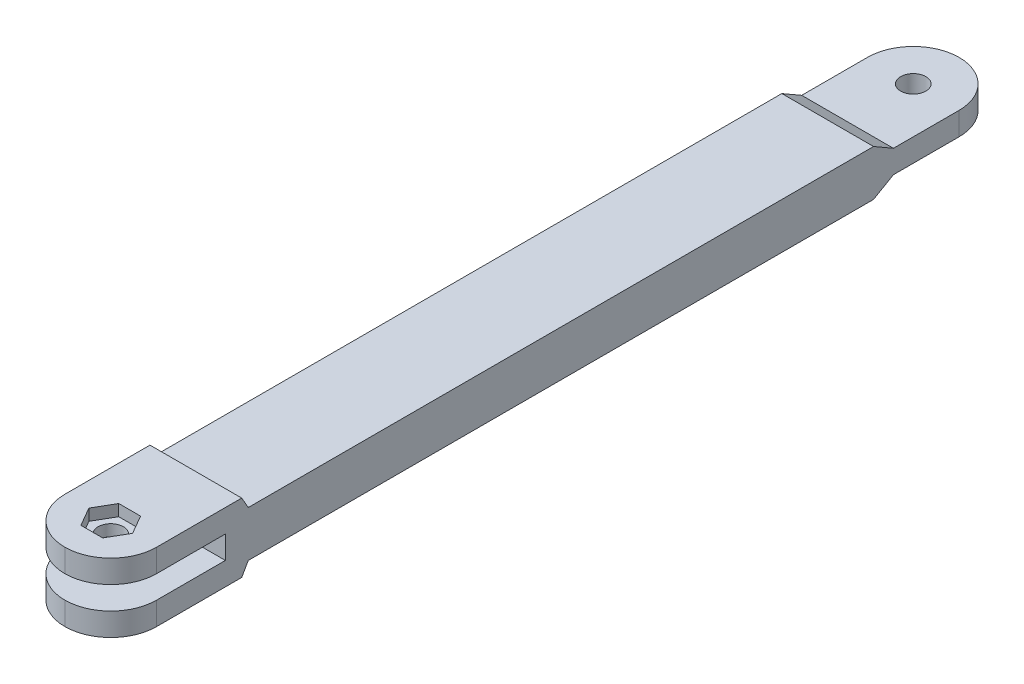
ISO-10303-21;
HEADER;
FILE_DESCRIPTION(('STEP AP214'),'2;1');
FILE_NAME('part.step','',(''),(''),'','','');
FILE_SCHEMA(('AUTOMOTIVE_DESIGN { 1 0 10303 214 1 1 1 1 }'));
ENDSEC;
DATA;
#1=APPLICATION_CONTEXT('core data for automotive mechanical design processes');
#2=APPLICATION_PROTOCOL_DEFINITION('international standard','automotive_design',2000,#1);
#3=PRODUCT_CONTEXT('',#1,'mechanical');
#4=PRODUCT('Part','Part','',(#3));
#5=PRODUCT_RELATED_PRODUCT_CATEGORY('part','',(#4));
#6=PRODUCT_DEFINITION_FORMATION('','',#4);
#7=PRODUCT_DEFINITION_CONTEXT('part definition',#1,'design');
#8=PRODUCT_DEFINITION('design','',#6,#7);
#9=PRODUCT_DEFINITION_SHAPE('','',#8);
#10=(LENGTH_UNIT() NAMED_UNIT(*) SI_UNIT(.MILLI.,.METRE.));
#11=(NAMED_UNIT(*) PLANE_ANGLE_UNIT() SI_UNIT($,.RADIAN.));
#12=(NAMED_UNIT(*) SI_UNIT($,.STERADIAN.) SOLID_ANGLE_UNIT());
#13=UNCERTAINTY_MEASURE_WITH_UNIT(LENGTH_MEASURE(1.E-05),#10,'distance_accuracy_value','');
#14=(GEOMETRIC_REPRESENTATION_CONTEXT(3) GLOBAL_UNCERTAINTY_ASSIGNED_CONTEXT((#13)) GLOBAL_UNIT_ASSIGNED_CONTEXT((#10,
#11,#12)) REPRESENTATION_CONTEXT('',''));
#15=CARTESIAN_POINT('',(0.,0.,0.));
#16=DIRECTION('',(0.,0.,1.));
#17=DIRECTION('',(1.,0.,0.));
#18=AXIS2_PLACEMENT_3D('',#15,#16,#17);
#19=CARTESIAN_POINT('',(-10.,7.5,100.));
#20=DIRECTION('',(0.,-1.,0.));
#21=DIRECTION('',(0.,0.,-1.));
#22=AXIS2_PLACEMENT_3D('',#19,#20,#21);
#23=PLANE('',#22);
#24=DIRECTION('',(0.,0.,-1.));
#25=VECTOR('',#24,1.);
#26=CARTESIAN_POINT('',(-10.,7.5,100.));
#27=LINE('',#26,#25);
#28=CARTESIAN_POINT('',(-10.,7.5,90.));
#29=VERTEX_POINT('',#28);
#30=CARTESIAN_POINT('',(-10.,7.5,71.443375672974));
#31=VERTEX_POINT('',#30);
#32=EDGE_CURVE('E299',#29,#31,#27,.T.);
#33=ORIENTED_EDGE('',*,*,#32,.F.);
#34=CARTESIAN_POINT('',(0.,7.5,90.));
#35=DIRECTION('',(0.,-1.,0.));
#36=DIRECTION('',(0.,0.,-1.));
#37=AXIS2_PLACEMENT_3D('',#34,#35,#36);
#38=CIRCLE('',#37,10.);
#39=CARTESIAN_POINT('',(0.,7.5,100.));
#40=VERTEX_POINT('',#39);
#41=EDGE_CURVE('E65',#29,#40,#38,.F.);
#42=ORIENTED_EDGE('',*,*,#41,.T.);
#43=CARTESIAN_POINT('',(0.,7.5,90.));
#44=DIRECTION('',(0.,-1.,0.));
#45=DIRECTION('',(0.,0.,-1.));
#46=AXIS2_PLACEMENT_3D('',#43,#44,#45);
#47=CIRCLE('',#46,10.);
#48=CARTESIAN_POINT('',(10.,7.5,90.));
#49=VERTEX_POINT('',#48);
#50=EDGE_CURVE('E456',#40,#49,#47,.F.);
#51=ORIENTED_EDGE('',*,*,#50,.T.);
#52=DIRECTION('',(0.,0.,-1.));
#53=VECTOR('',#52,1.);
#54=CARTESIAN_POINT('',(10.,7.5,100.));
#55=LINE('',#54,#53);
#56=CARTESIAN_POINT('',(10.,7.5,71.443375672974));
#57=VERTEX_POINT('',#56);
#58=EDGE_CURVE('E302',#49,#57,#55,.T.);
#59=ORIENTED_EDGE('',*,*,#58,.T.);
#60=DIRECTION('',(-1.,0.,0.));
#61=VECTOR('',#60,1.);
#62=CARTESIAN_POINT('',(-10.,7.5,71.443375672974));
#63=LINE('',#62,#61);
#64=EDGE_CURVE('E400',#57,#31,#63,.T.);
#65=ORIENTED_EDGE('',*,*,#64,.T.);
#66=EDGE_LOOP('',(#33,#42,#51,#59,#65));
#67=FACE_BOUND('',#66,.T.);
#68=DIRECTION('',(-1.,0.,0.));
#69=VECTOR('',#68,1.);
#70=CARTESIAN_POINT('',(-10.,7.5,85.875));
#71=LINE('',#70,#69);
#72=CARTESIAN_POINT('',(2.38156986040721,7.5,85.875));
#73=VERTEX_POINT('',#72);
#74=CARTESIAN_POINT('',(-2.38156986040721,7.5,85.875));
#75=VERTEX_POINT('',#74);
#76=EDGE_CURVE('E11',#73,#75,#71,.T.);
#77=ORIENTED_EDGE('',*,*,#76,.F.);
#78=DIRECTION('',(-0.5,0.,-0.866025403784439));
#79=VECTOR('',#78,1.);
#80=CARTESIAN_POINT('',(5.402481809533,7.5,91.1073729810778));
#81=LINE('',#80,#79);
#82=CARTESIAN_POINT('',(4.76313972081441,7.5,90.));
#83=VERTEX_POINT('',#82);
#84=EDGE_CURVE('E467',#83,#73,#81,.T.);
#85=ORIENTED_EDGE('',*,*,#84,.F.);
#86=DIRECTION('',(0.5,0.,-0.866025403784439));
#87=VECTOR('',#86,1.);
#88=CARTESIAN_POINT('',(-3.25777222831139,7.5,103.892627018922));
#89=LINE('',#88,#87);
#90=CARTESIAN_POINT('',(2.3815698604072,7.5,94.125));
#91=VERTEX_POINT('',#90);
#92=EDGE_CURVE('E485',#91,#83,#89,.T.);
#93=ORIENTED_EDGE('',*,*,#92,.F.);
#94=DIRECTION('',(1.,0.,0.));
#95=VECTOR('',#94,1.);
#96=CARTESIAN_POINT('',(-10.,7.5,94.125));
#97=LINE('',#96,#95);
#98=CARTESIAN_POINT('',(-2.3815698604072,7.5,94.125));
#99=VERTEX_POINT('',#98);
#100=EDGE_CURVE('E488',#99,#91,#97,.T.);
#101=ORIENTED_EDGE('',*,*,#100,.F.);
#102=DIRECTION('',(0.499999999999999,0.,0.866025403784439));
#103=VECTOR('',#102,1.);
#104=CARTESIAN_POINT('',(-1.74222777168861,7.5,95.2323729810778));
#105=LINE('',#104,#103);
#106=CARTESIAN_POINT('',(-4.76313972081441,7.5,90.));
#107=VERTEX_POINT('',#106);
#108=EDGE_CURVE('E491',#107,#99,#105,.T.);
#109=ORIENTED_EDGE('',*,*,#108,.F.);
#110=DIRECTION('',(-0.500000000000001,0.,0.866025403784438));
#111=VECTOR('',#110,1.);
#112=CARTESIAN_POINT('',(-10.402481809533,7.5,99.7676270189222));
#113=LINE('',#112,#111);
#114=EDGE_CURVE('E50',#75,#107,#113,.T.);
#115=ORIENTED_EDGE('',*,*,#114,.F.);
#116=EDGE_LOOP('',(#77,#85,#93,#101,#109,#115));
#117=FACE_BOUND('',#116,.T.);
#118=ADVANCED_FACE('F41',(#67,#117),#23,.F.);
#119=CARTESIAN_POINT('',(0.,-7.5,90.));
#120=DIRECTION('',(0.,1.,0.));
#121=DIRECTION('',(0.,0.,1.));
#122=AXIS2_PLACEMENT_3D('',#119,#120,#121);
#123=CYLINDRICAL_SURFACE('',#122,2.75);
#124=CARTESIAN_POINT('',(0.,2.5,90.));
#125=DIRECTION('',(0.,1.,0.));
#126=DIRECTION('',(-1.,0.,0.));
#127=AXIS2_PLACEMENT_3D('',#124,#125,#126);
#128=CIRCLE('',#127,2.75);
#129=CARTESIAN_POINT('',(-2.75,2.5,90.));
#130=VERTEX_POINT('',#129);
#131=EDGE_CURVE('E268',#130,#130,#128,.T.);
#132=ORIENTED_EDGE('',*,*,#131,.F.);
#133=EDGE_LOOP('',(#132));
#134=FACE_BOUND('',#133,.T.);
#135=CARTESIAN_POINT('',(0.,5.,90.));
#136=DIRECTION('',(0.,1.,0.));
#137=DIRECTION('',(0.,0.,1.));
#138=AXIS2_PLACEMENT_3D('',#135,#136,#137);
#139=CIRCLE('',#138,2.75);
#140=CARTESIAN_POINT('',(0.,5.,92.75));
#141=VERTEX_POINT('',#140);
#142=EDGE_CURVE('E219',#141,#141,#139,.F.);
#143=ORIENTED_EDGE('',*,*,#142,.F.);
#144=EDGE_LOOP('',(#143));
#145=FACE_BOUND('',#144,.T.);
#146=ADVANCED_FACE('F519',(#134,#145),#123,.F.);
#147=CARTESIAN_POINT('',(0.,0.,75.));
#148=DIRECTION('',(0.,0.,-1.));
#149=DIRECTION('',(-1.,0.,0.));
#150=AXIS2_PLACEMENT_3D('',#147,#148,#149);
#151=PLANE('',#150);
#152=DIRECTION('',(-1.,0.,0.));
#153=VECTOR('',#152,1.);
#154=CARTESIAN_POINT('',(-10.,-2.5,75.));
#155=LINE('',#154,#153);
#156=CARTESIAN_POINT('',(10.,-2.5,75.));
#157=VERTEX_POINT('',#156);
#158=CARTESIAN_POINT('',(-10.,-2.5,75.));
#159=VERTEX_POINT('',#158);
#160=EDGE_CURVE('E278',#157,#159,#155,.T.);
#161=ORIENTED_EDGE('',*,*,#160,.F.);
#162=DIRECTION('',(0.,1.,0.));
#163=VECTOR('',#162,1.);
#164=CARTESIAN_POINT('',(10.,-5.,75.));
#165=LINE('',#164,#163);
#166=CARTESIAN_POINT('',(10.,2.5,75.));
#167=VERTEX_POINT('',#166);
#168=EDGE_CURVE('E328',#157,#167,#165,.T.);
#169=ORIENTED_EDGE('',*,*,#168,.T.);
#170=DIRECTION('',(1.,0.,0.));
#171=VECTOR('',#170,1.);
#172=CARTESIAN_POINT('',(-10.,2.5,75.));
#173=LINE('',#172,#171);
#174=CARTESIAN_POINT('',(-10.,2.5,75.));
#175=VERTEX_POINT('',#174);
#176=EDGE_CURVE('E295',#175,#167,#173,.T.);
#177=ORIENTED_EDGE('',*,*,#176,.F.);
#178=DIRECTION('',(0.,-1.,0.));
#179=VECTOR('',#178,1.);
#180=CARTESIAN_POINT('',(-10.,-5.,75.));
#181=LINE('',#180,#179);
#182=EDGE_CURVE('E324',#175,#159,#181,.T.);
#183=ORIENTED_EDGE('',*,*,#182,.T.);
#184=EDGE_LOOP('',(#161,#169,#177,#183));
#185=FACE_BOUND('',#184,.T.);
#186=ADVANCED_FACE('F524',(#185),#151,.F.);
#187=CARTESIAN_POINT('',(-10.,-5.,-75.));
#188=DIRECTION('',(-1.,0.,0.));
#189=DIRECTION('',(0.,0.,1.));
#190=AXIS2_PLACEMENT_3D('',#187,#188,#189);
#191=PLANE('',#190);
#192=DIRECTION('',(0.,0.,-1.));
#193=VECTOR('',#192,1.);
#194=CARTESIAN_POINT('',(-10.,-7.5,100.));
#195=LINE('',#194,#193);
#196=CARTESIAN_POINT('',(-10.,-7.5,90.));
#197=VERTEX_POINT('',#196);
#198=CARTESIAN_POINT('',(-10.,-7.5,71.443375672974));
#199=VERTEX_POINT('',#198);
#200=EDGE_CURVE('E282',#197,#199,#195,.T.);
#201=ORIENTED_EDGE('',*,*,#200,.F.);
#202=DIRECTION('',(0.,-1.,0.));
#203=VECTOR('',#202,1.);
#204=CARTESIAN_POINT('',(-10.,-5.,90.));
#205=LINE('',#204,#203);
#206=CARTESIAN_POINT('',(-10.,-2.5,90.));
#207=VERTEX_POINT('',#206);
#208=EDGE_CURVE('E440',#197,#207,#205,.F.);
#209=ORIENTED_EDGE('',*,*,#208,.T.);
#210=DIRECTION('',(0.,0.,-1.));
#211=VECTOR('',#210,1.);
#212=CARTESIAN_POINT('',(-10.,-2.5,100.));
#213=LINE('',#212,#211);
#214=EDGE_CURVE('E286',#207,#159,#213,.T.);
#215=ORIENTED_EDGE('',*,*,#214,.T.);
#216=ORIENTED_EDGE('',*,*,#182,.F.);
#217=DIRECTION('',(0.,0.,-1.));
#218=VECTOR('',#217,1.);
#219=CARTESIAN_POINT('',(-10.,2.5,100.));
#220=LINE('',#219,#218);
#221=CARTESIAN_POINT('',(-10.,2.5,90.));
#222=VERTEX_POINT('',#221);
#223=EDGE_CURVE('E308',#222,#175,#220,.T.);
#224=ORIENTED_EDGE('',*,*,#223,.F.);
#225=DIRECTION('',(0.,-1.,0.));
#226=VECTOR('',#225,1.);
#227=CARTESIAN_POINT('',(-10.,-5.,90.));
#228=LINE('',#227,#226);
#229=EDGE_CURVE('E436',#222,#29,#228,.F.);
#230=ORIENTED_EDGE('',*,*,#229,.T.);
#231=ORIENTED_EDGE('',*,*,#32,.T.);
#232=DIRECTION('',(0.,-0.866025403784441,-0.499999999999996));
#233=VECTOR('',#232,1.);
#234=CARTESIAN_POINT('',(-10.,13.6602540378446,75.));
#235=LINE('',#234,#233);
#236=CARTESIAN_POINT('',(-10.,5.,69.9999999999999));
#237=VERTEX_POINT('',#236);
#238=EDGE_CURVE('E404',#31,#237,#235,.T.);
#239=ORIENTED_EDGE('',*,*,#238,.T.);
#240=DIRECTION('',(0.,0.,1.));
#241=VECTOR('',#240,1.);
#242=CARTESIAN_POINT('',(-10.,5.,-75.));
#243=LINE('',#242,#241);
#244=CARTESIAN_POINT('',(-10.,5.,-66.3397459621554));
#245=VERTEX_POINT('',#244);
#246=EDGE_CURVE('E333',#245,#237,#243,.T.);
#247=ORIENTED_EDGE('',*,*,#246,.F.);
#248=DIRECTION('',(0.,0.499999999999996,0.866025403784441));
#249=VECTOR('',#248,1.);
#250=CARTESIAN_POINT('',(-10.,-1.25000000000003,-77.1650635094611));
#251=LINE('',#250,#249);
#252=CARTESIAN_POINT('',(-10.,2.5,-70.6698729810777));
#253=VERTEX_POINT('',#252);
#254=EDGE_CURVE('E389',#245,#253,#251,.F.);
#255=ORIENTED_EDGE('',*,*,#254,.T.);
#256=DIRECTION('',(0.,0.,1.));
#257=VECTOR('',#256,1.);
#258=CARTESIAN_POINT('',(-10.,2.5,-95.));
#259=LINE('',#258,#257);
#260=CARTESIAN_POINT('',(-10.,2.5,-85.));
#261=VERTEX_POINT('',#260);
#262=EDGE_CURVE('E315',#261,#253,#259,.T.);
#263=ORIENTED_EDGE('',*,*,#262,.F.);
#264=DIRECTION('',(0.,1.,0.));
#265=VECTOR('',#264,1.);
#266=CARTESIAN_POINT('',(-10.,-5.,-85.));
#267=LINE('',#266,#265);
#268=CARTESIAN_POINT('',(-10.,-2.5,-85.));
#269=VERTEX_POINT('',#268);
#270=EDGE_CURVE('E354',#261,#269,#267,.F.);
#271=ORIENTED_EDGE('',*,*,#270,.T.);
#272=DIRECTION('',(0.,0.,1.));
#273=VECTOR('',#272,1.);
#274=CARTESIAN_POINT('',(-10.,-2.5,-95.));
#275=LINE('',#274,#273);
#276=CARTESIAN_POINT('',(-10.,-2.5,-70.6698729810777));
#277=VERTEX_POINT('',#276);
#278=EDGE_CURVE('E318',#269,#277,#275,.T.);
#279=ORIENTED_EDGE('',*,*,#278,.T.);
#280=DIRECTION('',(0.,0.499999999999996,-0.866025403784441));
#281=VECTOR('',#280,1.);
#282=CARTESIAN_POINT('',(-10.,-1.24999999999994,-72.8349364905389));
#283=LINE('',#282,#281);
#284=CARTESIAN_POINT('',(-10.,-5.,-66.3397459621554));
#285=VERTEX_POINT('',#284);
#286=EDGE_CURVE('E386',#277,#285,#283,.F.);
#287=ORIENTED_EDGE('',*,*,#286,.T.);
#288=DIRECTION('',(0.,0.,1.));
#289=VECTOR('',#288,1.);
#290=CARTESIAN_POINT('',(-10.,-5.,-75.));
#291=LINE('',#290,#289);
#292=CARTESIAN_POINT('',(-10.,-5.,69.9999999999999));
#293=VERTEX_POINT('',#292);
#294=EDGE_CURVE('E332',#285,#293,#291,.T.);
#295=ORIENTED_EDGE('',*,*,#294,.T.);
#296=DIRECTION('',(0.,-0.866025403784441,0.499999999999996));
#297=VECTOR('',#296,1.);
#298=CARTESIAN_POINT('',(-10.,-13.6602540378446,75.));
#299=LINE('',#298,#297);
#300=EDGE_CURVE('E418',#293,#199,#299,.T.);
#301=ORIENTED_EDGE('',*,*,#300,.T.);
#302=EDGE_LOOP('',(#201,#209,#215,#216,#224,#230,#231,#239,#247,#255,#263,#271,#279,#287,#295,#301));
#303=FACE_BOUND('',#302,.T.);
#304=ADVANCED_FACE('F549',(#303),#191,.T.);
#305=CARTESIAN_POINT('',(-10.,5.,-75.));
#306=DIRECTION('',(0.,1.,0.));
#307=DIRECTION('',(0.,0.,1.));
#308=AXIS2_PLACEMENT_3D('',#305,#306,#307);
#309=PLANE('',#308);
#310=ORIENTED_EDGE('',*,*,#246,.T.);
#311=DIRECTION('',(1.,0.,0.));
#312=VECTOR('',#311,1.);
#313=CARTESIAN_POINT('',(-10.,5.,69.9999999999999));
#314=LINE('',#313,#312);
#315=CARTESIAN_POINT('',(10.,5.,69.9999999999999));
#316=VERTEX_POINT('',#315);
#317=EDGE_CURVE('E374',#237,#316,#314,.T.);
#318=ORIENTED_EDGE('',*,*,#317,.T.);
#319=DIRECTION('',(0.,0.,1.));
#320=VECTOR('',#319,1.);
#321=CARTESIAN_POINT('',(10.,5.,-75.));
#322=LINE('',#321,#320);
#323=CARTESIAN_POINT('',(10.,5.,-66.3397459621554));
#324=VERTEX_POINT('',#323);
#325=EDGE_CURVE('E338',#324,#316,#322,.T.);
#326=ORIENTED_EDGE('',*,*,#325,.F.);
#327=DIRECTION('',(-1.,0.,0.));
#328=VECTOR('',#327,1.);
#329=CARTESIAN_POINT('',(-10.,5.,-66.3397459621554));
#330=LINE('',#329,#328);
#331=EDGE_CURVE('E367',#324,#245,#330,.T.);
#332=ORIENTED_EDGE('',*,*,#331,.T.);
#333=EDGE_LOOP('',(#310,#318,#326,#332));
#334=FACE_BOUND('',#333,.T.);
#335=ADVANCED_FACE('F551',(#334),#309,.T.);
#336=CARTESIAN_POINT('',(10.,-5.,-75.));
#337=DIRECTION('',(1.,0.,0.));
#338=DIRECTION('',(0.,0.,-1.));
#339=AXIS2_PLACEMENT_3D('',#336,#337,#338);
#340=PLANE('',#339);
#341=DIRECTION('',(0.,0.,-1.));
#342=VECTOR('',#341,1.);
#343=CARTESIAN_POINT('',(10.,-2.5,100.));
#344=LINE('',#343,#342);
#345=CARTESIAN_POINT('',(10.,-2.5,90.));
#346=VERTEX_POINT('',#345);
#347=EDGE_CURVE('E289',#346,#157,#344,.T.);
#348=ORIENTED_EDGE('',*,*,#347,.F.);
#349=DIRECTION('',(0.,1.,0.));
#350=VECTOR('',#349,1.);
#351=CARTESIAN_POINT('',(10.,-5.,90.));
#352=LINE('',#351,#350);
#353=CARTESIAN_POINT('',(10.,-7.5,90.));
#354=VERTEX_POINT('',#353);
#355=EDGE_CURVE('E464',#346,#354,#352,.F.);
#356=ORIENTED_EDGE('',*,*,#355,.T.);
#357=DIRECTION('',(0.,0.,-1.));
#358=VECTOR('',#357,1.);
#359=CARTESIAN_POINT('',(10.,-7.5,100.));
#360=LINE('',#359,#358);
#361=CARTESIAN_POINT('',(10.,-7.5,71.443375672974));
#362=VERTEX_POINT('',#361);
#363=EDGE_CURVE('E292',#354,#362,#360,.T.);
#364=ORIENTED_EDGE('',*,*,#363,.T.);
#365=DIRECTION('',(0.,0.866025403784441,-0.499999999999996));
#366=VECTOR('',#365,1.);
#367=CARTESIAN_POINT('',(10.,-13.6602540378446,75.));
#368=LINE('',#367,#366);
#369=CARTESIAN_POINT('',(10.,-5.,69.9999999999999));
#370=VERTEX_POINT('',#369);
#371=EDGE_CURVE('E415',#362,#370,#368,.T.);
#372=ORIENTED_EDGE('',*,*,#371,.T.);
#373=DIRECTION('',(0.,0.,1.));
#374=VECTOR('',#373,1.);
#375=CARTESIAN_POINT('',(10.,-5.,-75.));
#376=LINE('',#375,#374);
#377=CARTESIAN_POINT('',(10.,-5.,-66.3397459621554));
#378=VERTEX_POINT('',#377);
#379=EDGE_CURVE('E342',#378,#370,#376,.T.);
#380=ORIENTED_EDGE('',*,*,#379,.F.);
#381=DIRECTION('',(0.,-0.499999999999996,0.866025403784441));
#382=VECTOR('',#381,1.);
#383=CARTESIAN_POINT('',(10.,-1.24999999999994,-72.8349364905389));
#384=LINE('',#383,#382);
#385=CARTESIAN_POINT('',(10.,-2.5,-70.6698729810777));
#386=VERTEX_POINT('',#385);
#387=EDGE_CURVE('E393',#378,#386,#384,.F.);
#388=ORIENTED_EDGE('',*,*,#387,.T.);
#389=DIRECTION('',(0.,0.,1.));
#390=VECTOR('',#389,1.);
#391=CARTESIAN_POINT('',(10.,-2.5,-95.));
#392=LINE('',#391,#390);
#393=CARTESIAN_POINT('',(10.,-2.5,-85.));
#394=VERTEX_POINT('',#393);
#395=EDGE_CURVE('E321',#394,#386,#392,.T.);
#396=ORIENTED_EDGE('',*,*,#395,.F.);
#397=DIRECTION('',(0.,-1.,0.));
#398=VECTOR('',#397,1.);
#399=CARTESIAN_POINT('',(10.,-5.,-85.));
#400=LINE('',#399,#398);
#401=CARTESIAN_POINT('',(10.,2.5,-85.));
#402=VERTEX_POINT('',#401);
#403=EDGE_CURVE('E364',#394,#402,#400,.F.);
#404=ORIENTED_EDGE('',*,*,#403,.T.);
#405=DIRECTION('',(0.,0.,1.));
#406=VECTOR('',#405,1.);
#407=CARTESIAN_POINT('',(10.,2.5,-95.));
#408=LINE('',#407,#406);
#409=CARTESIAN_POINT('',(10.,2.5,-70.6698729810777));
#410=VERTEX_POINT('',#409);
#411=EDGE_CURVE('E312',#402,#410,#408,.T.);
#412=ORIENTED_EDGE('',*,*,#411,.T.);
#413=DIRECTION('',(0.,-0.499999999999996,-0.866025403784441));
#414=VECTOR('',#413,1.);
#415=CARTESIAN_POINT('',(10.,-1.25000000000003,-77.1650635094611));
#416=LINE('',#415,#414);
#417=EDGE_CURVE('E397',#410,#324,#416,.F.);
#418=ORIENTED_EDGE('',*,*,#417,.T.);
#419=ORIENTED_EDGE('',*,*,#325,.T.);
#420=DIRECTION('',(0.,0.866025403784441,0.499999999999996));
#421=VECTOR('',#420,1.);
#422=CARTESIAN_POINT('',(10.,13.6602540378446,75.));
#423=LINE('',#422,#421);
#424=EDGE_CURVE('E407',#316,#57,#423,.T.);
#425=ORIENTED_EDGE('',*,*,#424,.T.);
#426=ORIENTED_EDGE('',*,*,#58,.F.);
#427=DIRECTION('',(0.,1.,0.));
#428=VECTOR('',#427,1.);
#429=CARTESIAN_POINT('',(10.,-5.,90.));
#430=LINE('',#429,#428);
#431=CARTESIAN_POINT('',(10.,2.5,90.));
#432=VERTEX_POINT('',#431);
#433=EDGE_CURVE('E461',#49,#432,#430,.F.);
#434=ORIENTED_EDGE('',*,*,#433,.T.);
#435=DIRECTION('',(0.,0.,-1.));
#436=VECTOR('',#435,1.);
#437=CARTESIAN_POINT('',(10.,2.5,100.));
#438=LINE('',#437,#436);
#439=EDGE_CURVE('E305',#432,#167,#438,.T.);
#440=ORIENTED_EDGE('',*,*,#439,.T.);
#441=ORIENTED_EDGE('',*,*,#168,.F.);
#442=EDGE_LOOP('',(#348,#356,#364,#372,#380,#388,#396,#404,#412,#418,#419,#425,#426,#434,#440,#441));
#443=FACE_BOUND('',#442,.T.);
#444=ADVANCED_FACE('F554',(#443),#340,.T.);
#445=CARTESIAN_POINT('',(-10.,-5.,-75.));
#446=DIRECTION('',(0.,-1.,0.));
#447=DIRECTION('',(0.,0.,-1.));
#448=AXIS2_PLACEMENT_3D('',#445,#446,#447);
#449=PLANE('',#448);
#450=ORIENTED_EDGE('',*,*,#379,.T.);
#451=DIRECTION('',(-1.,0.,0.));
#452=VECTOR('',#451,1.);
#453=CARTESIAN_POINT('',(-10.,-5.,69.9999999999999));
#454=LINE('',#453,#452);
#455=EDGE_CURVE('E382',#370,#293,#454,.T.);
#456=ORIENTED_EDGE('',*,*,#455,.T.);
#457=ORIENTED_EDGE('',*,*,#294,.F.);
#458=DIRECTION('',(1.,0.,0.));
#459=VECTOR('',#458,1.);
#460=CARTESIAN_POINT('',(-10.,-5.,-66.3397459621554));
#461=LINE('',#460,#459);
#462=EDGE_CURVE('E378',#285,#378,#461,.T.);
#463=ORIENTED_EDGE('',*,*,#462,.T.);
#464=EDGE_LOOP('',(#450,#456,#457,#463));
#465=FACE_BOUND('',#464,.T.);
#466=ADVANCED_FACE('F545',(#465),#449,.T.);
#467=CARTESIAN_POINT('',(10.,-2.5,-95.));
#468=DIRECTION('',(0.,1.,0.));
#469=DIRECTION('',(0.,0.,1.));
#470=AXIS2_PLACEMENT_3D('',#467,#468,#469);
#471=PLANE('',#470);
#472=CARTESIAN_POINT('',(0.,-2.5,-85.));
#473=DIRECTION('',(0.,1.,0.));
#474=DIRECTION('',(0.,0.,1.));
#475=AXIS2_PLACEMENT_3D('',#472,#473,#474);
#476=CIRCLE('',#475,2.75);
#477=CARTESIAN_POINT('',(0.,-2.5,-82.25));
#478=VERTEX_POINT('',#477);
#479=EDGE_CURVE('E273',#478,#478,#476,.T.);
#480=ORIENTED_EDGE('',*,*,#479,.T.);
#481=EDGE_LOOP('',(#480));
#482=FACE_BOUND('',#481,.T.);
#483=ORIENTED_EDGE('',*,*,#278,.F.);
#484=CARTESIAN_POINT('',(0.,-2.5,-85.));
#485=DIRECTION('',(0.,1.,0.));
#486=DIRECTION('',(0.,0.,1.));
#487=AXIS2_PLACEMENT_3D('',#484,#485,#486);
#488=CIRCLE('',#487,10.);
#489=CARTESIAN_POINT('',(0.,-2.5,-95.));
#490=VERTEX_POINT('',#489);
#491=EDGE_CURVE('E361',#269,#490,#488,.F.);
#492=ORIENTED_EDGE('',*,*,#491,.T.);
#493=CARTESIAN_POINT('',(0.,-2.5,-85.));
#494=DIRECTION('',(0.,1.,0.));
#495=DIRECTION('',(0.,0.,1.));
#496=AXIS2_PLACEMENT_3D('',#493,#494,#495);
#497=CIRCLE('',#496,10.);
#498=EDGE_CURVE('E358',#490,#394,#497,.F.);
#499=ORIENTED_EDGE('',*,*,#498,.T.);
#500=ORIENTED_EDGE('',*,*,#395,.T.);
#501=DIRECTION('',(1.,0.,0.));
#502=VECTOR('',#501,1.);
#503=CARTESIAN_POINT('',(10.,-2.5,-70.6698729810777));
#504=LINE('',#503,#502);
#505=EDGE_CURVE('E426',#386,#277,#504,.F.);
#506=ORIENTED_EDGE('',*,*,#505,.T.);
#507=EDGE_LOOP('',(#483,#492,#499,#500,#506));
#508=FACE_BOUND('',#507,.T.);
#509=ADVANCED_FACE('F541',(#482,#508),#471,.F.);
#510=CARTESIAN_POINT('',(10.,2.5,-95.));
#511=DIRECTION('',(0.,-1.,0.));
#512=DIRECTION('',(0.,0.,-1.));
#513=AXIS2_PLACEMENT_3D('',#510,#511,#512);
#514=PLANE('',#513);
#515=CARTESIAN_POINT('',(0.,2.5,-85.));
#516=DIRECTION('',(0.,-1.,0.));
#517=DIRECTION('',(0.,0.,-1.));
#518=AXIS2_PLACEMENT_3D('',#515,#516,#517);
#519=CIRCLE('',#518,2.75);
#520=CARTESIAN_POINT('',(0.,2.5,-87.75));
#521=VERTEX_POINT('',#520);
#522=EDGE_CURVE('E272',#521,#521,#519,.T.);
#523=ORIENTED_EDGE('',*,*,#522,.T.);
#524=EDGE_LOOP('',(#523));
#525=FACE_BOUND('',#524,.T.);
#526=CARTESIAN_POINT('',(0.,2.5,-85.));
#527=DIRECTION('',(0.,-1.,0.));
#528=DIRECTION('',(0.,0.,-1.));
#529=AXIS2_PLACEMENT_3D('',#526,#527,#528);
#530=CIRCLE('',#529,10.);
#531=CARTESIAN_POINT('',(0.,2.5,-95.));
#532=VERTEX_POINT('',#531);
#533=EDGE_CURVE('E337',#402,#532,#530,.F.);
#534=ORIENTED_EDGE('',*,*,#533,.T.);
#535=CARTESIAN_POINT('',(0.,2.5,-85.));
#536=DIRECTION('',(0.,-1.,0.));
#537=DIRECTION('',(0.,0.,-1.));
#538=AXIS2_PLACEMENT_3D('',#535,#536,#537);
#539=CIRCLE('',#538,10.);
#540=EDGE_CURVE('E351',#532,#261,#539,.F.);
#541=ORIENTED_EDGE('',*,*,#540,.T.);
#542=ORIENTED_EDGE('',*,*,#262,.T.);
#543=DIRECTION('',(-1.,0.,0.));
#544=VECTOR('',#543,1.);
#545=CARTESIAN_POINT('',(10.,2.5,-70.6698729810777));
#546=LINE('',#545,#544);
#547=EDGE_CURVE('E422',#253,#410,#546,.F.);
#548=ORIENTED_EDGE('',*,*,#547,.T.);
#549=ORIENTED_EDGE('',*,*,#411,.F.);
#550=EDGE_LOOP('',(#534,#541,#542,#548,#549));
#551=FACE_BOUND('',#550,.T.);
#552=ADVANCED_FACE('F537',(#525,#551),#514,.F.);
#553=CARTESIAN_POINT('',(0.,0.,-85.));
#554=DIRECTION('',(0.,-1.,0.));
#555=DIRECTION('',(0.,0.,-1.));
#556=AXIS2_PLACEMENT_3D('',#553,#554,#555);
#557=CYLINDRICAL_SURFACE('',#556,10.);
#558=ORIENTED_EDGE('',*,*,#403,.F.);
#559=ORIENTED_EDGE('',*,*,#498,.F.);
#560=DIRECTION('',(0.,-1.,0.));
#561=VECTOR('',#560,1.);
#562=CARTESIAN_POINT('',(0.,0.,-95.));
#563=LINE('',#562,#561);
#564=EDGE_CURVE('E311',#532,#490,#563,.T.);
#565=ORIENTED_EDGE('',*,*,#564,.F.);
#566=ORIENTED_EDGE('',*,*,#533,.F.);
#567=EDGE_LOOP('',(#558,#559,#565,#566));
#568=FACE_BOUND('',#567,.T.);
#569=ADVANCED_FACE('F540',(#568),#557,.T.);
#570=CARTESIAN_POINT('',(0.,0.,-85.));
#571=DIRECTION('',(0.,1.,0.));
#572=DIRECTION('',(0.,0.,1.));
#573=AXIS2_PLACEMENT_3D('',#570,#571,#572);
#574=CYLINDRICAL_SURFACE('',#573,10.);
#575=ORIENTED_EDGE('',*,*,#491,.F.);
#576=ORIENTED_EDGE('',*,*,#270,.F.);
#577=ORIENTED_EDGE('',*,*,#540,.F.);
#578=ORIENTED_EDGE('',*,*,#564,.T.);
#579=EDGE_LOOP('',(#575,#576,#577,#578));
#580=FACE_BOUND('',#579,.T.);
#581=ADVANCED_FACE('F535',(#580),#574,.T.);
#582=CARTESIAN_POINT('',(-10.,2.5,100.));
#583=DIRECTION('',(0.,1.,0.));
#584=DIRECTION('',(-1.,0.,0.));
#585=AXIS2_PLACEMENT_3D('',#582,#583,#584);
#586=PLANE('',#585);
#587=ORIENTED_EDGE('',*,*,#131,.T.);
#588=EDGE_LOOP('',(#587));
#589=FACE_BOUND('',#588,.T.);
#590=CARTESIAN_POINT('',(0.,2.5,90.));
#591=DIRECTION('',(0.,1.,0.));
#592=DIRECTION('',(-1.,0.,0.));
#593=AXIS2_PLACEMENT_3D('',#590,#591,#592);
#594=CIRCLE('',#593,10.);
#595=CARTESIAN_POINT('',(0.,2.5,100.));
#596=VERTEX_POINT('',#595);
#597=EDGE_CURVE('E450',#432,#596,#594,.F.);
#598=ORIENTED_EDGE('',*,*,#597,.T.);
#599=CARTESIAN_POINT('',(0.,2.5,90.));
#600=DIRECTION('',(0.,1.,0.));
#601=DIRECTION('',(-1.,0.,0.));
#602=AXIS2_PLACEMENT_3D('',#599,#600,#601);
#603=CIRCLE('',#602,10.);
#604=EDGE_CURVE('E453',#596,#222,#603,.F.);
#605=ORIENTED_EDGE('',*,*,#604,.T.);
#606=ORIENTED_EDGE('',*,*,#223,.T.);
#607=ORIENTED_EDGE('',*,*,#176,.T.);
#608=ORIENTED_EDGE('',*,*,#439,.F.);
#609=EDGE_LOOP('',(#598,#605,#606,#607,#608));
#610=FACE_BOUND('',#609,.T.);
#611=ADVANCED_FACE('F532',(#589,#610),#586,.F.);
#612=CARTESIAN_POINT('',(-10.,-7.5,100.));
#613=DIRECTION('',(0.,1.,0.));
#614=DIRECTION('',(0.,0.,1.));
#615=AXIS2_PLACEMENT_3D('',#612,#613,#614);
#616=PLANE('',#615);
#617=CARTESIAN_POINT('',(0.,-7.5,90.));
#618=DIRECTION('',(0.,1.,0.));
#619=DIRECTION('',(0.,0.,1.));
#620=AXIS2_PLACEMENT_3D('',#617,#618,#619);
#621=CIRCLE('',#620,2.75);
#622=CARTESIAN_POINT('',(0.,-7.5,92.75));
#623=VERTEX_POINT('',#622);
#624=EDGE_CURVE('E263',#623,#623,#621,.T.);
#625=ORIENTED_EDGE('',*,*,#624,.T.);
#626=EDGE_LOOP('',(#625));
#627=FACE_BOUND('',#626,.T.);
#628=CARTESIAN_POINT('',(0.,-7.5,90.));
#629=DIRECTION('',(0.,1.,0.));
#630=DIRECTION('',(0.,0.,1.));
#631=AXIS2_PLACEMENT_3D('',#628,#629,#630);
#632=CIRCLE('',#631,10.);
#633=CARTESIAN_POINT('',(0.,-7.5,100.));
#634=VERTEX_POINT('',#633);
#635=EDGE_CURVE('E430',#354,#634,#632,.F.);
#636=ORIENTED_EDGE('',*,*,#635,.T.);
#637=CARTESIAN_POINT('',(0.,-7.5,90.));
#638=DIRECTION('',(0.,1.,0.));
#639=DIRECTION('',(0.,0.,1.));
#640=AXIS2_PLACEMENT_3D('',#637,#638,#639);
#641=CIRCLE('',#640,10.);
#642=EDGE_CURVE('E433',#634,#197,#641,.F.);
#643=ORIENTED_EDGE('',*,*,#642,.T.);
#644=ORIENTED_EDGE('',*,*,#200,.T.);
#645=DIRECTION('',(1.,0.,0.));
#646=VECTOR('',#645,1.);
#647=CARTESIAN_POINT('',(-10.,-7.5,71.443375672974));
#648=LINE('',#647,#646);
#649=EDGE_CURVE('E411',#199,#362,#648,.T.);
#650=ORIENTED_EDGE('',*,*,#649,.T.);
#651=ORIENTED_EDGE('',*,*,#363,.F.);
#652=EDGE_LOOP('',(#636,#643,#644,#650,#651));
#653=FACE_BOUND('',#652,.T.);
#654=ADVANCED_FACE('F530',(#627,#653),#616,.F.);
#655=CARTESIAN_POINT('',(-10.,-2.5,100.));
#656=DIRECTION('',(0.,-1.,0.));
#657=DIRECTION('',(1.,0.,0.));
#658=AXIS2_PLACEMENT_3D('',#655,#656,#657);
#659=PLANE('',#658);
#660=CARTESIAN_POINT('',(0.,-2.5,90.));
#661=DIRECTION('',(0.,-1.,0.));
#662=DIRECTION('',(1.,0.,0.));
#663=AXIS2_PLACEMENT_3D('',#660,#661,#662);
#664=CIRCLE('',#663,2.75);
#665=CARTESIAN_POINT('',(2.75,-2.5,90.));
#666=VERTEX_POINT('',#665);
#667=EDGE_CURVE('E267',#666,#666,#664,.T.);
#668=ORIENTED_EDGE('',*,*,#667,.T.);
#669=EDGE_LOOP('',(#668));
#670=FACE_BOUND('',#669,.T.);
#671=ORIENTED_EDGE('',*,*,#214,.F.);
#672=CARTESIAN_POINT('',(0.,-2.5,90.));
#673=DIRECTION('',(0.,-1.,0.));
#674=DIRECTION('',(1.,0.,0.));
#675=AXIS2_PLACEMENT_3D('',#672,#673,#674);
#676=CIRCLE('',#675,10.);
#677=CARTESIAN_POINT('',(0.,-2.5,100.));
#678=VERTEX_POINT('',#677);
#679=EDGE_CURVE('E447',#207,#678,#676,.F.);
#680=ORIENTED_EDGE('',*,*,#679,.T.);
#681=CARTESIAN_POINT('',(0.,-2.5,90.));
#682=DIRECTION('',(0.,-1.,0.));
#683=DIRECTION('',(1.,0.,0.));
#684=AXIS2_PLACEMENT_3D('',#681,#682,#683);
#685=CIRCLE('',#684,10.);
#686=EDGE_CURVE('E444',#678,#346,#685,.F.);
#687=ORIENTED_EDGE('',*,*,#686,.T.);
#688=ORIENTED_EDGE('',*,*,#347,.T.);
#689=ORIENTED_EDGE('',*,*,#160,.T.);
#690=EDGE_LOOP('',(#671,#680,#687,#688,#689));
#691=FACE_BOUND('',#690,.T.);
#692=ADVANCED_FACE('F575',(#670,#691),#659,.F.);
#693=CARTESIAN_POINT('',(0.,13.6602540378446,75.));
#694=DIRECTION('',(0.,-0.499999999999996,0.866025403784441));
#695=DIRECTION('',(-1.,0.,0.));
#696=AXIS2_PLACEMENT_3D('',#693,#694,#695);
#697=PLANE('',#696);
#698=ORIENTED_EDGE('',*,*,#424,.F.);
#699=ORIENTED_EDGE('',*,*,#317,.F.);
#700=ORIENTED_EDGE('',*,*,#238,.F.);
#701=ORIENTED_EDGE('',*,*,#64,.F.);
#702=EDGE_LOOP('',(#698,#699,#700,#701));
#703=FACE_BOUND('',#702,.T.);
#704=ADVANCED_FACE('F571',(#703),#697,.F.);
#705=CARTESIAN_POINT('',(0.,-13.6602540378446,75.));
#706=DIRECTION('',(0.,0.499999999999996,0.866025403784441));
#707=DIRECTION('',(1.,0.,0.));
#708=AXIS2_PLACEMENT_3D('',#705,#706,#707);
#709=PLANE('',#708);
#710=ORIENTED_EDGE('',*,*,#300,.F.);
#711=ORIENTED_EDGE('',*,*,#455,.F.);
#712=ORIENTED_EDGE('',*,*,#371,.F.);
#713=ORIENTED_EDGE('',*,*,#649,.F.);
#714=EDGE_LOOP('',(#710,#711,#712,#713));
#715=FACE_BOUND('',#714,.T.);
#716=ADVANCED_FACE('F574',(#715),#709,.F.);
#717=CARTESIAN_POINT('',(-10.,5.,-66.3397459621554));
#718=DIRECTION('',(0.,-0.866025403784441,0.499999999999996));
#719=DIRECTION('',(-1.,0.,0.));
#720=AXIS2_PLACEMENT_3D('',#717,#718,#719);
#721=PLANE('',#720);
#722=ORIENTED_EDGE('',*,*,#417,.F.);
#723=ORIENTED_EDGE('',*,*,#547,.F.);
#724=ORIENTED_EDGE('',*,*,#254,.F.);
#725=ORIENTED_EDGE('',*,*,#331,.F.);
#726=EDGE_LOOP('',(#722,#723,#724,#725));
#727=FACE_BOUND('',#726,.T.);
#728=ADVANCED_FACE('F579',(#727),#721,.F.);
#729=CARTESIAN_POINT('',(-10.,-5.,-66.3397459621554));
#730=DIRECTION('',(0.,0.866025403784441,0.499999999999996));
#731=DIRECTION('',(1.,0.,0.));
#732=AXIS2_PLACEMENT_3D('',#729,#730,#731);
#733=PLANE('',#732);
#734=ORIENTED_EDGE('',*,*,#286,.F.);
#735=ORIENTED_EDGE('',*,*,#505,.F.);
#736=ORIENTED_EDGE('',*,*,#387,.F.);
#737=ORIENTED_EDGE('',*,*,#462,.F.);
#738=EDGE_LOOP('',(#734,#735,#736,#737));
#739=FACE_BOUND('',#738,.T.);
#740=ADVANCED_FACE('F583',(#739),#733,.F.);
#741=CARTESIAN_POINT('',(0.,0.,90.));
#742=DIRECTION('',(0.,1.,0.));
#743=DIRECTION('',(0.,0.,1.));
#744=AXIS2_PLACEMENT_3D('',#741,#742,#743);
#745=CYLINDRICAL_SURFACE('',#744,10.);
#746=ORIENTED_EDGE('',*,*,#355,.F.);
#747=ORIENTED_EDGE('',*,*,#686,.F.);
#748=DIRECTION('',(0.,1.,0.));
#749=VECTOR('',#748,1.);
#750=CARTESIAN_POINT('',(0.,0.,100.));
#751=LINE('',#750,#749);
#752=EDGE_CURVE('E283',#634,#678,#751,.T.);
#753=ORIENTED_EDGE('',*,*,#752,.F.);
#754=ORIENTED_EDGE('',*,*,#635,.F.);
#755=EDGE_LOOP('',(#746,#747,#753,#754));
#756=FACE_BOUND('',#755,.T.);
#757=ADVANCED_FACE('F587',(#756),#745,.T.);
#758=CARTESIAN_POINT('',(0.,0.,90.));
#759=DIRECTION('',(0.,-1.,0.));
#760=DIRECTION('',(0.,0.,-1.));
#761=AXIS2_PLACEMENT_3D('',#758,#759,#760);
#762=CYLINDRICAL_SURFACE('',#761,10.);
#763=ORIENTED_EDGE('',*,*,#679,.F.);
#764=ORIENTED_EDGE('',*,*,#208,.F.);
#765=ORIENTED_EDGE('',*,*,#642,.F.);
#766=ORIENTED_EDGE('',*,*,#752,.T.);
#767=EDGE_LOOP('',(#763,#764,#765,#766));
#768=FACE_BOUND('',#767,.T.);
#769=ADVANCED_FACE('F589',(#768),#762,.T.);
#770=CARTESIAN_POINT('',(0.,0.,90.));
#771=DIRECTION('',(0.,1.,0.));
#772=DIRECTION('',(0.,0.,1.));
#773=AXIS2_PLACEMENT_3D('',#770,#771,#772);
#774=CYLINDRICAL_SURFACE('',#773,10.);
#775=ORIENTED_EDGE('',*,*,#433,.F.);
#776=ORIENTED_EDGE('',*,*,#50,.F.);
#777=DIRECTION('',(0.,1.,0.));
#778=VECTOR('',#777,1.);
#779=CARTESIAN_POINT('',(0.,0.,100.));
#780=LINE('',#779,#778);
#781=EDGE_CURVE('E277',#596,#40,#780,.T.);
#782=ORIENTED_EDGE('',*,*,#781,.F.);
#783=ORIENTED_EDGE('',*,*,#597,.F.);
#784=EDGE_LOOP('',(#775,#776,#782,#783));
#785=FACE_BOUND('',#784,.T.);
#786=ADVANCED_FACE('F43',(#785),#774,.T.);
#787=CARTESIAN_POINT('',(0.,0.,90.));
#788=DIRECTION('',(0.,-1.,0.));
#789=DIRECTION('',(0.,0.,-1.));
#790=AXIS2_PLACEMENT_3D('',#787,#788,#789);
#791=CYLINDRICAL_SURFACE('',#790,10.);
#792=ORIENTED_EDGE('',*,*,#41,.F.);
#793=ORIENTED_EDGE('',*,*,#229,.F.);
#794=ORIENTED_EDGE('',*,*,#604,.F.);
#795=ORIENTED_EDGE('',*,*,#781,.T.);
#796=EDGE_LOOP('',(#792,#793,#794,#795));
#797=FACE_BOUND('',#796,.T.);
#798=ADVANCED_FACE('F595',(#797),#791,.T.);
#799=ORIENTED_EDGE('',*,*,#624,.F.);
#800=EDGE_LOOP('',(#799));
#801=FACE_BOUND('',#800,.T.);
#802=ORIENTED_EDGE('',*,*,#667,.F.);
#803=EDGE_LOOP('',(#802));
#804=FACE_BOUND('',#803,.T.);
#805=ADVANCED_FACE('F527',(#801,#804),#123,.F.);
#806=CARTESIAN_POINT('',(0.,-7.5,-85.));
#807=DIRECTION('',(0.,1.,0.));
#808=DIRECTION('',(0.,0.,1.));
#809=AXIS2_PLACEMENT_3D('',#806,#807,#808);
#810=CYLINDRICAL_SURFACE('',#809,2.75);
#811=ORIENTED_EDGE('',*,*,#522,.F.);
#812=EDGE_LOOP('',(#811));
#813=FACE_BOUND('',#812,.T.);
#814=ORIENTED_EDGE('',*,*,#479,.F.);
#815=EDGE_LOOP('',(#814));
#816=FACE_BOUND('',#815,.T.);
#817=ADVANCED_FACE('F602',(#813,#816),#810,.F.);
#818=CARTESIAN_POINT('',(2.38156986040721,7.500012,85.875));
#819=DIRECTION('',(0.,0.,1.));
#820=DIRECTION('',(1.,0.,0.));
#821=AXIS2_PLACEMENT_3D('',#818,#819,#820);
#822=PLANE('',#821);
#823=ORIENTED_EDGE('',*,*,#76,.T.);
#824=DIRECTION('',(0.,-1.,0.));
#825=VECTOR('',#824,1.);
#826=CARTESIAN_POINT('',(-2.38156986040721,7.500012,85.875));
#827=LINE('',#826,#825);
#828=CARTESIAN_POINT('',(-2.38156986040721,5.,85.875));
#829=VERTEX_POINT('',#828);
#830=EDGE_CURVE('E208',#75,#829,#827,.T.);
#831=ORIENTED_EDGE('',*,*,#830,.T.);
#832=DIRECTION('',(-1.,0.,0.));
#833=VECTOR('',#832,1.);
#834=CARTESIAN_POINT('',(2.38156986040721,5.,85.875));
#835=LINE('',#834,#833);
#836=CARTESIAN_POINT('',(2.38156986040721,5.,85.875));
#837=VERTEX_POINT('',#836);
#838=EDGE_CURVE('E213',#837,#829,#835,.T.);
#839=ORIENTED_EDGE('',*,*,#838,.F.);
#840=DIRECTION('',(0.,-1.,0.));
#841=VECTOR('',#840,1.);
#842=CARTESIAN_POINT('',(2.38156986040721,7.500012,85.875));
#843=LINE('',#842,#841);
#844=EDGE_CURVE('E250',#73,#837,#843,.T.);
#845=ORIENTED_EDGE('',*,*,#844,.F.);
#846=EDGE_LOOP('',(#823,#831,#839,#845));
#847=FACE_BOUND('',#846,.T.);
#848=ADVANCED_FACE('F210',(#847),#822,.T.);
#849=CARTESIAN_POINT('',(-2.38156986040721,7.500012,85.875));
#850=DIRECTION('',(0.866025403784438,0.,0.500000000000001));
#851=DIRECTION('',(0.500000000000001,0.,-0.866025403784438));
#852=AXIS2_PLACEMENT_3D('',#849,#850,#851);
#853=PLANE('',#852);
#854=ORIENTED_EDGE('',*,*,#114,.T.);
#855=DIRECTION('',(0.,-1.,0.));
#856=VECTOR('',#855,1.);
#857=CARTESIAN_POINT('',(-4.76313972081441,7.500012,90.));
#858=LINE('',#857,#856);
#859=CARTESIAN_POINT('',(-4.76313972081441,5.,90.));
#860=VERTEX_POINT('',#859);
#861=EDGE_CURVE('E220',#107,#860,#858,.T.);
#862=ORIENTED_EDGE('',*,*,#861,.T.);
#863=DIRECTION('',(-0.500000000000001,0.,0.866025403784438));
#864=VECTOR('',#863,1.);
#865=CARTESIAN_POINT('',(-2.38156986040721,5.,85.875));
#866=LINE('',#865,#864);
#867=EDGE_CURVE('E223',#829,#860,#866,.T.);
#868=ORIENTED_EDGE('',*,*,#867,.F.);
#869=ORIENTED_EDGE('',*,*,#830,.F.);
#870=EDGE_LOOP('',(#854,#862,#868,#869));
#871=FACE_BOUND('',#870,.T.);
#872=ADVANCED_FACE('F224',(#871),#853,.T.);
#873=CARTESIAN_POINT('',(-4.76313972081441,7.500012,90.));
#874=DIRECTION('',(0.866025403784439,0.,-0.499999999999999));
#875=DIRECTION('',(-0.499999999999999,0.,-0.866025403784439));
#876=AXIS2_PLACEMENT_3D('',#873,#874,#875);
#877=PLANE('',#876);
#878=ORIENTED_EDGE('',*,*,#108,.T.);
#879=DIRECTION('',(0.,-1.,0.));
#880=VECTOR('',#879,1.);
#881=CARTESIAN_POINT('',(-2.3815698604072,7.500012,94.125));
#882=LINE('',#881,#880);
#883=CARTESIAN_POINT('',(-2.3815698604072,5.,94.125));
#884=VERTEX_POINT('',#883);
#885=EDGE_CURVE('E258',#99,#884,#882,.T.);
#886=ORIENTED_EDGE('',*,*,#885,.T.);
#887=DIRECTION('',(0.499999999999999,0.,0.866025403784439));
#888=VECTOR('',#887,1.);
#889=CARTESIAN_POINT('',(-4.76313972081441,5.,90.));
#890=LINE('',#889,#888);
#891=EDGE_CURVE('E230',#860,#884,#890,.T.);
#892=ORIENTED_EDGE('',*,*,#891,.F.);
#893=ORIENTED_EDGE('',*,*,#861,.F.);
#894=EDGE_LOOP('',(#878,#886,#892,#893));
#895=FACE_BOUND('',#894,.T.);
#896=ADVANCED_FACE('F497',(#895),#877,.T.);
#897=CARTESIAN_POINT('',(-2.3815698604072,7.500012,94.125));
#898=DIRECTION('',(0.,0.,-1.));
#899=DIRECTION('',(-1.,0.,0.));
#900=AXIS2_PLACEMENT_3D('',#897,#898,#899);
#901=PLANE('',#900);
#902=ORIENTED_EDGE('',*,*,#100,.T.);
#903=DIRECTION('',(0.,-1.,0.));
#904=VECTOR('',#903,1.);
#905=CARTESIAN_POINT('',(2.3815698604072,7.500012,94.125));
#906=LINE('',#905,#904);
#907=CARTESIAN_POINT('',(2.3815698604072,5.,94.125));
#908=VERTEX_POINT('',#907);
#909=EDGE_CURVE('E255',#91,#908,#906,.T.);
#910=ORIENTED_EDGE('',*,*,#909,.T.);
#911=DIRECTION('',(1.,0.,0.));
#912=VECTOR('',#911,1.);
#913=CARTESIAN_POINT('',(-2.3815698604072,5.,94.125));
#914=LINE('',#913,#912);
#915=EDGE_CURVE('E241',#884,#908,#914,.T.);
#916=ORIENTED_EDGE('',*,*,#915,.F.);
#917=ORIENTED_EDGE('',*,*,#885,.F.);
#918=EDGE_LOOP('',(#902,#910,#916,#917));
#919=FACE_BOUND('',#918,.T.);
#920=ADVANCED_FACE('F504',(#919),#901,.T.);
#921=CARTESIAN_POINT('',(2.3815698604072,7.500012,94.125));
#922=DIRECTION('',(-0.866025403784439,0.,-0.5));
#923=DIRECTION('',(-0.5,0.,0.866025403784439));
#924=AXIS2_PLACEMENT_3D('',#921,#922,#923);
#925=PLANE('',#924);
#926=ORIENTED_EDGE('',*,*,#92,.T.);
#927=DIRECTION('',(0.,-1.,0.));
#928=VECTOR('',#927,1.);
#929=CARTESIAN_POINT('',(4.76313972081441,7.500012,90.));
#930=LINE('',#929,#928);
#931=CARTESIAN_POINT('',(4.76313972081441,5.,90.));
#932=VERTEX_POINT('',#931);
#933=EDGE_CURVE('E57',#83,#932,#930,.T.);
#934=ORIENTED_EDGE('',*,*,#933,.T.);
#935=DIRECTION('',(0.5,0.,-0.866025403784438));
#936=VECTOR('',#935,1.);
#937=CARTESIAN_POINT('',(2.3815698604072,5.,94.125));
#938=LINE('',#937,#936);
#939=EDGE_CURVE('E245',#908,#932,#938,.T.);
#940=ORIENTED_EDGE('',*,*,#939,.F.);
#941=ORIENTED_EDGE('',*,*,#909,.F.);
#942=EDGE_LOOP('',(#926,#934,#940,#941));
#943=FACE_BOUND('',#942,.T.);
#944=ADVANCED_FACE('F508',(#943),#925,.T.);
#945=CARTESIAN_POINT('',(4.76313972081441,7.500012,90.));
#946=DIRECTION('',(-0.866025403784439,0.,0.5));
#947=DIRECTION('',(0.5,0.,0.866025403784439));
#948=AXIS2_PLACEMENT_3D('',#945,#946,#947);
#949=PLANE('',#948);
#950=ORIENTED_EDGE('',*,*,#84,.T.);
#951=ORIENTED_EDGE('',*,*,#844,.T.);
#952=DIRECTION('',(-0.5,0.,-0.866025403784439));
#953=VECTOR('',#952,1.);
#954=CARTESIAN_POINT('',(4.76313972081441,5.,90.));
#955=LINE('',#954,#953);
#956=EDGE_CURVE('E235',#932,#837,#955,.T.);
#957=ORIENTED_EDGE('',*,*,#956,.F.);
#958=ORIENTED_EDGE('',*,*,#933,.F.);
#959=EDGE_LOOP('',(#950,#951,#957,#958));
#960=FACE_BOUND('',#959,.T.);
#961=ADVANCED_FACE('F509',(#960),#949,.T.);
#962=CARTESIAN_POINT('',(0.,5.,0.));
#963=DIRECTION('',(0.,1.,0.));
#964=DIRECTION('',(0.,0.,1.));
#965=AXIS2_PLACEMENT_3D('',#962,#963,#964);
#966=PLANE('',#965);
#967=ORIENTED_EDGE('',*,*,#838,.T.);
#968=ORIENTED_EDGE('',*,*,#867,.T.);
#969=ORIENTED_EDGE('',*,*,#891,.T.);
#970=ORIENTED_EDGE('',*,*,#915,.T.);
#971=ORIENTED_EDGE('',*,*,#939,.T.);
#972=ORIENTED_EDGE('',*,*,#956,.T.);
#973=EDGE_LOOP('',(#967,#968,#969,#970,#971,#972));
#974=FACE_BOUND('',#973,.T.);
#975=ORIENTED_EDGE('',*,*,#142,.T.);
#976=EDGE_LOOP('',(#975));
#977=FACE_BOUND('',#976,.T.);
#978=ADVANCED_FACE('F232',(#974,#977),#966,.T.);
#979=CLOSED_SHELL('',(#118,#146,#186,#304,#335,#444,#466,#509,#552,#569,#581,#611,#654,#692,
#704,#716,#728,#740,#757,#769,#786,#798,#805,#817,#848,#872,#896,#920,#944,#961,#978));
#980=MANIFOLD_SOLID_BREP('B2',#979);
#981=ADVANCED_BREP_SHAPE_REPRESENTATION('',(#18,#980),#14);
#982=SHAPE_DEFINITION_REPRESENTATION(#9,#981);
ENDSEC;
END-ISO-10303-21;
